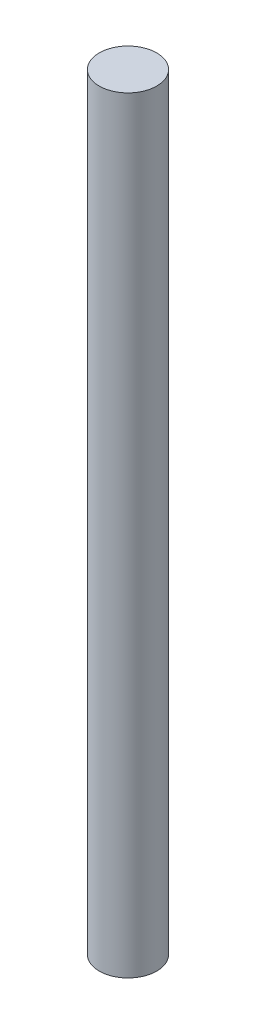
ISO-10303-21;
HEADER;
FILE_DESCRIPTION(('STEP AP214'),'2;1');
FILE_NAME('part.step','',(''),(''),'','','');
FILE_SCHEMA(('AUTOMOTIVE_DESIGN { 1 0 10303 214 1 1 1 1 }'));
ENDSEC;
DATA;
#1=APPLICATION_CONTEXT('core data for automotive mechanical design processes');
#2=APPLICATION_PROTOCOL_DEFINITION('international standard','automotive_design',2000,#1);
#3=PRODUCT_CONTEXT('',#1,'mechanical');
#4=PRODUCT('Part','Part','',(#3));
#5=PRODUCT_RELATED_PRODUCT_CATEGORY('part','',(#4));
#6=PRODUCT_DEFINITION_FORMATION('','',#4);
#7=PRODUCT_DEFINITION_CONTEXT('part definition',#1,'design');
#8=PRODUCT_DEFINITION('design','',#6,#7);
#9=PRODUCT_DEFINITION_SHAPE('','',#8);
#10=(LENGTH_UNIT() NAMED_UNIT(*) SI_UNIT(.MILLI.,.METRE.));
#11=(NAMED_UNIT(*) PLANE_ANGLE_UNIT() SI_UNIT($,.RADIAN.));
#12=(NAMED_UNIT(*) SI_UNIT($,.STERADIAN.) SOLID_ANGLE_UNIT());
#13=UNCERTAINTY_MEASURE_WITH_UNIT(LENGTH_MEASURE(1.E-05),#10,'distance_accuracy_value','');
#14=(GEOMETRIC_REPRESENTATION_CONTEXT(3) GLOBAL_UNCERTAINTY_ASSIGNED_CONTEXT((#13)) GLOBAL_UNIT_ASSIGNED_CONTEXT((#10,
#11,#12)) REPRESENTATION_CONTEXT('',''));
#15=CARTESIAN_POINT('',(0.,0.,0.));
#16=DIRECTION('',(0.,0.,1.));
#17=DIRECTION('',(1.,0.,0.));
#18=AXIS2_PLACEMENT_3D('',#15,#16,#17);
#19=CARTESIAN_POINT('',(-289.008733795656,2000.,81.332648835913));
#20=DIRECTION('',(0.,-1.,0.));
#21=DIRECTION('',(0.,0.,-1.));
#22=AXIS2_PLACEMENT_3D('',#19,#20,#21);
#23=CYLINDRICAL_SURFACE('',#22,75.);
#24=CARTESIAN_POINT('',(-289.008733795656,2000.,81.332648835913));
#25=DIRECTION('',(0.,1.,0.));
#26=DIRECTION('',(0.,0.,1.));
#27=AXIS2_PLACEMENT_3D('',#24,#25,#26);
#28=CIRCLE('',#27,75.);
#29=CARTESIAN_POINT('',(-289.008733795656,2000.,156.332648835913));
#30=VERTEX_POINT('',#29);
#31=EDGE_CURVE('E10',#30,#30,#28,.T.);
#32=ORIENTED_EDGE('',*,*,#31,.F.);
#33=EDGE_LOOP('',(#32));
#34=FACE_BOUND('',#33,.T.);
#35=CARTESIAN_POINT('',(-289.008733795656,0.,81.332648835913));
#36=DIRECTION('',(0.,1.,0.));
#37=DIRECTION('',(0.,0.,1.));
#38=AXIS2_PLACEMENT_3D('',#35,#36,#37);
#39=CIRCLE('',#38,75.);
#40=CARTESIAN_POINT('',(-289.008733795656,0.,156.332648835913));
#41=VERTEX_POINT('',#40);
#42=EDGE_CURVE('E42',#41,#41,#39,.T.);
#43=ORIENTED_EDGE('',*,*,#42,.T.);
#44=EDGE_LOOP('',(#43));
#45=FACE_BOUND('',#44,.T.);
#46=ADVANCED_FACE('F39',(#34,#45),#23,.T.);
#47=CARTESIAN_POINT('',(-289.008733795656,2000.,81.332648835913));
#48=DIRECTION('',(0.,1.,0.));
#49=DIRECTION('',(0.,0.,1.));
#50=AXIS2_PLACEMENT_3D('',#47,#48,#49);
#51=PLANE('',#50);
#52=ORIENTED_EDGE('',*,*,#31,.T.);
#53=EDGE_LOOP('',(#52));
#54=FACE_BOUND('',#53,.T.);
#55=ADVANCED_FACE('F54',(#54),#51,.T.);
#56=CARTESIAN_POINT('',(-289.008733795656,0.,81.332648835913));
#57=DIRECTION('',(0.,1.,0.));
#58=DIRECTION('',(0.,0.,1.));
#59=AXIS2_PLACEMENT_3D('',#56,#57,#58);
#60=PLANE('',#59);
#61=ORIENTED_EDGE('',*,*,#42,.F.);
#62=EDGE_LOOP('',(#61));
#63=FACE_BOUND('',#62,.T.);
#64=ADVANCED_FACE('F52',(#63),#60,.F.);
#65=CLOSED_SHELL('',(#46,#55,#64));
#66=MANIFOLD_SOLID_BREP('B2',#65);
#67=ADVANCED_BREP_SHAPE_REPRESENTATION('',(#18,#66),#14);
#68=SHAPE_DEFINITION_REPRESENTATION(#9,#67);
ENDSEC;
END-ISO-10303-21;
